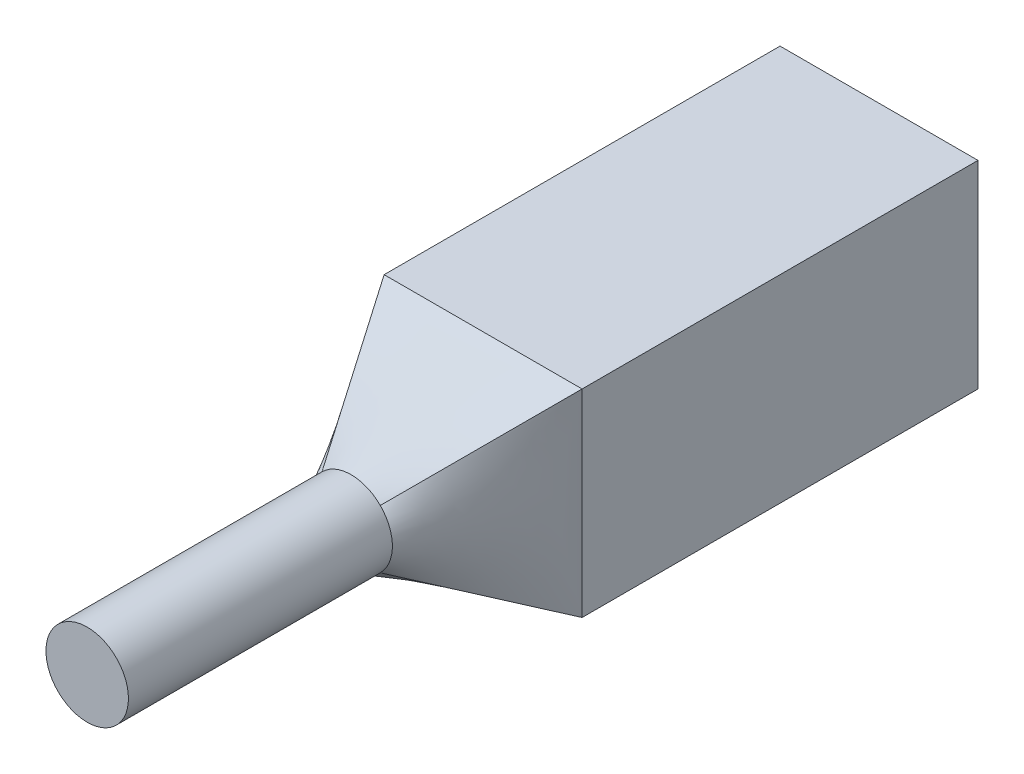
ISO-10303-21;
HEADER;
FILE_DESCRIPTION(('STEP AP214'),'2;1');
FILE_NAME('part.step','',(''),(''),'','','');
FILE_SCHEMA(('AUTOMOTIVE_DESIGN { 1 0 10303 214 1 1 1 1 }'));
ENDSEC;
DATA;
#1=APPLICATION_CONTEXT('core data for automotive mechanical design processes');
#2=APPLICATION_PROTOCOL_DEFINITION('international standard','automotive_design',2000,#1);
#3=PRODUCT_CONTEXT('',#1,'mechanical');
#4=PRODUCT('Part','Part','',(#3));
#5=PRODUCT_RELATED_PRODUCT_CATEGORY('part','',(#4));
#6=PRODUCT_DEFINITION_FORMATION('','',#4);
#7=PRODUCT_DEFINITION_CONTEXT('part definition',#1,'design');
#8=PRODUCT_DEFINITION('design','',#6,#7);
#9=PRODUCT_DEFINITION_SHAPE('','',#8);
#10=(LENGTH_UNIT() NAMED_UNIT(*) SI_UNIT(.MILLI.,.METRE.));
#11=(NAMED_UNIT(*) PLANE_ANGLE_UNIT() SI_UNIT($,.RADIAN.));
#12=(NAMED_UNIT(*) SI_UNIT($,.STERADIAN.) SOLID_ANGLE_UNIT());
#13=UNCERTAINTY_MEASURE_WITH_UNIT(LENGTH_MEASURE(1.E-05),#10,'distance_accuracy_value','');
#14=(GEOMETRIC_REPRESENTATION_CONTEXT(3) GLOBAL_UNCERTAINTY_ASSIGNED_CONTEXT((#13)) GLOBAL_UNIT_ASSIGNED_CONTEXT((#10,
#11,#12)) REPRESENTATION_CONTEXT('',''));
#15=CARTESIAN_POINT('',(0.,0.,0.));
#16=DIRECTION('',(0.,0.,1.));
#17=DIRECTION('',(1.,0.,0.));
#18=AXIS2_PLACEMENT_3D('',#15,#16,#17);
#19=CARTESIAN_POINT('',(0.,0.,38.1));
#20=DIRECTION('',(1.,0.,0.));
#21=DIRECTION('',(0.,0.,-1.));
#22=AXIS2_PLACEMENT_3D('',#19,#20,#21);
#23=PLANE('',#22);
#24=DIRECTION('',(0.,-1.,0.));
#25=VECTOR('',#24,1.);
#26=CARTESIAN_POINT('',(0.,0.,0.));
#27=LINE('',#26,#25);
#28=CARTESIAN_POINT('',(0.,19.05,0.));
#29=VERTEX_POINT('',#28);
#30=CARTESIAN_POINT('',(0.,0.,0.));
#31=VERTEX_POINT('',#30);
#32=EDGE_CURVE('E185',#29,#31,#27,.T.);
#33=ORIENTED_EDGE('',*,*,#32,.T.);
#34=DIRECTION('',(0.,0.,-1.));
#35=VECTOR('',#34,1.);
#36=CARTESIAN_POINT('',(0.,0.,38.1));
#37=LINE('',#36,#35);
#38=CARTESIAN_POINT('',(0.,0.,38.1));
#39=VERTEX_POINT('',#38);
#40=EDGE_CURVE('E12',#39,#31,#37,.T.);
#41=ORIENTED_EDGE('',*,*,#40,.F.);
#42=DIRECTION('',(0.,1.,0.));
#43=VECTOR('',#42,1.);
#44=CARTESIAN_POINT('',(0.,0.,38.1));
#45=LINE('',#44,#43);
#46=CARTESIAN_POINT('',(0.,19.05,38.1));
#47=VERTEX_POINT('',#46);
#48=EDGE_CURVE('E142',#47,#39,#45,.F.);
#49=ORIENTED_EDGE('',*,*,#48,.F.);
#50=DIRECTION('',(0.,0.,-1.));
#51=VECTOR('',#50,1.);
#52=CARTESIAN_POINT('',(0.,19.05,38.1));
#53=LINE('',#52,#51);
#54=EDGE_CURVE('E167',#47,#29,#53,.T.);
#55=ORIENTED_EDGE('',*,*,#54,.T.);
#56=EDGE_LOOP('',(#33,#41,#49,#55));
#57=FACE_BOUND('',#56,.T.);
#58=ADVANCED_FACE('F67',(#57),#23,.F.);
#59=CARTESIAN_POINT('',(0.,0.,38.1));
#60=DIRECTION('',(0.,1.,0.));
#61=DIRECTION('',(0.,0.,1.));
#62=AXIS2_PLACEMENT_3D('',#59,#60,#61);
#63=PLANE('',#62);
#64=DIRECTION('',(1.,0.,0.));
#65=VECTOR('',#64,1.);
#66=CARTESIAN_POINT('',(0.,0.,0.));
#67=LINE('',#66,#65);
#68=CARTESIAN_POINT('',(19.05,0.,0.));
#69=VERTEX_POINT('',#68);
#70=EDGE_CURVE('E183',#31,#69,#67,.T.);
#71=ORIENTED_EDGE('',*,*,#70,.T.);
#72=DIRECTION('',(0.,0.,-1.));
#73=VECTOR('',#72,1.);
#74=CARTESIAN_POINT('',(19.05,0.,38.1));
#75=LINE('',#74,#73);
#76=CARTESIAN_POINT('',(19.05,0.,38.1));
#77=VERTEX_POINT('',#76);
#78=EDGE_CURVE('E77',#77,#69,#75,.T.);
#79=ORIENTED_EDGE('',*,*,#78,.F.);
#80=DIRECTION('',(1.,0.,0.));
#81=VECTOR('',#80,1.);
#82=CARTESIAN_POINT('',(0.,0.,38.1));
#83=LINE('',#82,#81);
#84=EDGE_CURVE('E171',#39,#77,#83,.T.);
#85=ORIENTED_EDGE('',*,*,#84,.F.);
#86=ORIENTED_EDGE('',*,*,#40,.T.);
#87=EDGE_LOOP('',(#71,#79,#85,#86));
#88=FACE_BOUND('',#87,.T.);
#89=ADVANCED_FACE('F272',(#88),#63,.F.);
#90=CARTESIAN_POINT('',(19.05,0.,38.1));
#91=DIRECTION('',(-1.,0.,0.));
#92=DIRECTION('',(0.,0.,1.));
#93=AXIS2_PLACEMENT_3D('',#90,#91,#92);
#94=PLANE('',#93);
#95=DIRECTION('',(0.,1.,0.));
#96=VECTOR('',#95,1.);
#97=CARTESIAN_POINT('',(19.05,0.,0.));
#98=LINE('',#97,#96);
#99=CARTESIAN_POINT('',(19.05,19.05,0.));
#100=VERTEX_POINT('',#99);
#101=EDGE_CURVE('E181',#69,#100,#98,.T.);
#102=ORIENTED_EDGE('',*,*,#101,.T.);
#103=DIRECTION('',(0.,0.,-1.));
#104=VECTOR('',#103,1.);
#105=CARTESIAN_POINT('',(19.05,19.05,38.1));
#106=LINE('',#105,#104);
#107=CARTESIAN_POINT('',(19.05,19.05,38.1));
#108=VERTEX_POINT('',#107);
#109=EDGE_CURVE('E85',#108,#100,#106,.T.);
#110=ORIENTED_EDGE('',*,*,#109,.F.);
#111=DIRECTION('',(0.,1.,0.));
#112=VECTOR('',#111,1.);
#113=CARTESIAN_POINT('',(19.05,0.,38.1));
#114=LINE('',#113,#112);
#115=EDGE_CURVE('E168',#77,#108,#114,.T.);
#116=ORIENTED_EDGE('',*,*,#115,.F.);
#117=ORIENTED_EDGE('',*,*,#78,.T.);
#118=EDGE_LOOP('',(#102,#110,#116,#117));
#119=FACE_BOUND('',#118,.T.);
#120=ADVANCED_FACE('F277',(#119),#94,.F.);
#121=CARTESIAN_POINT('',(0.,19.05,38.1));
#122=DIRECTION('',(0.,-1.,0.));
#123=DIRECTION('',(0.,0.,-1.));
#124=AXIS2_PLACEMENT_3D('',#121,#122,#123);
#125=PLANE('',#124);
#126=DIRECTION('',(-1.,0.,0.));
#127=VECTOR('',#126,1.);
#128=CARTESIAN_POINT('',(0.,19.05,0.));
#129=LINE('',#128,#127);
#130=EDGE_CURVE('E173',#100,#29,#129,.T.);
#131=ORIENTED_EDGE('',*,*,#130,.T.);
#132=ORIENTED_EDGE('',*,*,#54,.F.);
#133=DIRECTION('',(1.,0.,0.));
#134=VECTOR('',#133,1.);
#135=CARTESIAN_POINT('',(0.,19.05,38.1));
#136=LINE('',#135,#134);
#137=EDGE_CURVE('E164',#108,#47,#136,.F.);
#138=ORIENTED_EDGE('',*,*,#137,.F.);
#139=ORIENTED_EDGE('',*,*,#109,.T.);
#140=EDGE_LOOP('',(#131,#132,#138,#139));
#141=FACE_BOUND('',#140,.T.);
#142=ADVANCED_FACE('F290',(#141),#125,.F.);
#143=CARTESIAN_POINT('',(0.,0.,0.));
#144=DIRECTION('',(0.,0.,-1.));
#145=DIRECTION('',(-1.,0.,0.));
#146=AXIS2_PLACEMENT_3D('',#143,#144,#145);
#147=PLANE('',#146);
#148=ORIENTED_EDGE('',*,*,#32,.F.);
#149=ORIENTED_EDGE('',*,*,#130,.F.);
#150=ORIENTED_EDGE('',*,*,#101,.F.);
#151=ORIENTED_EDGE('',*,*,#70,.F.);
#152=EDGE_LOOP('',(#148,#149,#150,#151));
#153=FACE_BOUND('',#152,.T.);
#154=ADVANCED_FACE('F219',(#153),#147,.T.);
#155=CARTESIAN_POINT('',(12.3313300378341,12.3313300378341,50.8));
#156=CARTESIAN_POINT('',(19.05,19.05,38.1));
#157=CARTESIAN_POINT('',(12.6620592045008,12.0006008711674,50.8));
#158=CARTESIAN_POINT('',(19.05,17.4625,38.1));
#159=CARTESIAN_POINT('',(12.9585981787103,11.5835090371438,50.8));
#160=CARTESIAN_POINT('',(19.05,15.875,38.1));
#161=CARTESIAN_POINT('',(13.3759779779088,10.6190861586301,50.8));
#162=CARTESIAN_POINT('',(19.05,12.7,38.1));
#163=CARTESIAN_POINT('',(13.49375,10.0729700252227,50.8));
#164=CARTESIAN_POINT('',(19.05,11.1125,38.1));
#165=CARTESIAN_POINT('',(13.49375,8.97702997477725,50.8));
#166=CARTESIAN_POINT('',(19.05,7.93749999999999,38.1));
#167=CARTESIAN_POINT('',(13.3759779779088,8.43091384136988,50.8));
#168=CARTESIAN_POINT('',(19.05,6.34999999999999,38.1));
#169=CARTESIAN_POINT('',(12.9585981787103,7.46649096285624,50.8));
#170=CARTESIAN_POINT('',(19.05,3.175,38.1));
#171=CARTESIAN_POINT('',(12.6620592045008,7.04939912883255,50.8));
#172=CARTESIAN_POINT('',(19.05,1.5875,38.1));
#173=CARTESIAN_POINT('',(12.3313300378341,6.71866996216589,50.8));
#174=CARTESIAN_POINT('',(19.05,0.,38.1));
#175=B_SPLINE_SURFACE_WITH_KNOTS('',3,1,((#155,#156),(#157,#158),(#159,#160),(#161,#162),(#163,
#164),(#165,#166),(#167,#168),(#169,#170),(#171,#172),(#173,#174)),.UNSPECIFIED.,.F.,.F.,.F.,(4,
2,2,2,4),(2,2),(0.,0.25,0.5,0.75,1.),(0.,1.),.UNSPECIFIED.);
#176=CARTESIAN_POINT('',(9.525,9.525,50.8));
#177=DIRECTION('',(0.,0.,1.));
#178=DIRECTION('',(1.,0.,0.));
#179=AXIS2_PLACEMENT_3D('',#176,#177,#178);
#180=CIRCLE('',#179,3.96875);
#181=CARTESIAN_POINT('',(12.3313300378341,6.71866996216589,50.8));
#182=VERTEX_POINT('',#181);
#183=CARTESIAN_POINT('',(12.3313300378341,12.3313300378341,50.8));
#184=VERTEX_POINT('',#183);
#185=EDGE_CURVE('E70',#182,#184,#180,.T.);
#186=DIRECTION('',(0.423597096817351,-0.423597096817351,-0.800706562440838));
#187=VECTOR('',#186,1.);
#188=CARTESIAN_POINT('',(15.6906650189171,3.35933498108294,44.45));
#189=LINE('',#188,#187);
#190=EDGE_CURVE('E126',#182,#77,#189,.T.);
#191=DIRECTION('',(-0.423597096817351,-0.423597096817351,0.800706562440838));
#192=VECTOR('',#191,1.);
#193=CARTESIAN_POINT('',(15.6906650189171,15.6906650189171,44.45));
#194=LINE('',#193,#192);
#195=EDGE_CURVE('E131',#108,#184,#194,.T.);
#196=ORIENTED_EDGE('',*,*,#185,.F.);
#197=ORIENTED_EDGE('',*,*,#190,.T.);
#198=ORIENTED_EDGE('',*,*,#115,.T.);
#199=ORIENTED_EDGE('',*,*,#195,.T.);
#200=EDGE_LOOP('',(#196,#197,#198,#199));
#201=FACE_BOUND('',#200,.T.);
#202=ADVANCED_FACE('F246',(#201),#175,.T.);
#203=CARTESIAN_POINT('',(12.3313300378341,6.71866996216589,50.8));
#204=CARTESIAN_POINT('',(19.05,0.,38.1));
#205=CARTESIAN_POINT('',(12.0006008711674,6.38794079549922,50.8));
#206=CARTESIAN_POINT('',(17.4625,0.,38.1));
#207=CARTESIAN_POINT('',(11.5835090371438,6.09140182128975,50.8));
#208=CARTESIAN_POINT('',(15.875,0.,38.1));
#209=CARTESIAN_POINT('',(10.6190861586301,5.67402202209115,50.8));
#210=CARTESIAN_POINT('',(12.7,0.,38.1));
#211=CARTESIAN_POINT('',(10.0729700252227,5.55625,50.8));
#212=CARTESIAN_POINT('',(11.1125,0.,38.1));
#213=CARTESIAN_POINT('',(8.97702997477727,5.55625,50.8));
#214=CARTESIAN_POINT('',(7.93749999999998,0.,38.1));
#215=CARTESIAN_POINT('',(8.43091384136989,5.67402202209115,50.8));
#216=CARTESIAN_POINT('',(6.34999999999998,0.,38.1));
#217=CARTESIAN_POINT('',(7.46649096285624,6.09140182128975,50.8));
#218=CARTESIAN_POINT('',(3.17499999999999,0.,38.1));
#219=CARTESIAN_POINT('',(7.04939912883256,6.38794079549922,50.8));
#220=CARTESIAN_POINT('',(1.58749999999999,0.,38.1));
#221=CARTESIAN_POINT('',(6.71866996216589,6.71866996216589,50.8));
#222=CARTESIAN_POINT('',(0.,0.,38.1));
#223=B_SPLINE_SURFACE_WITH_KNOTS('',3,1,((#203,#204),(#205,#206),(#207,#208),(#209,#210),(#211,
#212),(#213,#214),(#215,#216),(#217,#218),(#219,#220),(#221,#222)),.UNSPECIFIED.,.F.,.F.,.F.,(4,
2,2,2,4),(2,2),(0.,0.25,0.5,0.75,1.),(0.,1.),.UNSPECIFIED.);
#224=CARTESIAN_POINT('',(6.71866996216589,6.71866996216589,50.8));
#225=VERTEX_POINT('',#224);
#226=EDGE_CURVE('E119',#225,#182,#180,.T.);
#227=DIRECTION('',(-0.423597096817352,-0.423597096817351,-0.800706562440837));
#228=VECTOR('',#227,1.);
#229=CARTESIAN_POINT('',(3.35933498108295,3.35933498108294,44.45));
#230=LINE('',#229,#228);
#231=EDGE_CURVE('E124',#225,#39,#230,.T.);
#232=ORIENTED_EDGE('',*,*,#226,.F.);
#233=ORIENTED_EDGE('',*,*,#231,.T.);
#234=ORIENTED_EDGE('',*,*,#84,.T.);
#235=ORIENTED_EDGE('',*,*,#190,.F.);
#236=EDGE_LOOP('',(#232,#233,#234,#235));
#237=FACE_BOUND('',#236,.T.);
#238=ADVANCED_FACE('F122',(#237),#223,.T.);
#239=CARTESIAN_POINT('',(6.71866996216589,12.3313300378341,50.8));
#240=CARTESIAN_POINT('',(0.,19.05,38.1));
#241=CARTESIAN_POINT('',(7.04939912883256,12.6620592045008,50.8));
#242=CARTESIAN_POINT('',(1.5875,19.05,38.1));
#243=CARTESIAN_POINT('',(7.46649096285624,12.9585981787103,50.8));
#244=CARTESIAN_POINT('',(3.17499999999999,19.05,38.1));
#245=CARTESIAN_POINT('',(8.43091384136989,13.3759779779088,50.8));
#246=CARTESIAN_POINT('',(6.34999999999999,19.05,38.1));
#247=CARTESIAN_POINT('',(8.97702997477727,13.49375,50.8));
#248=CARTESIAN_POINT('',(7.93749999999999,19.05,38.1));
#249=CARTESIAN_POINT('',(10.0729700252227,13.49375,50.8));
#250=CARTESIAN_POINT('',(11.1125,19.05,38.1));
#251=CARTESIAN_POINT('',(10.6190861586301,13.3759779779088,50.8));
#252=CARTESIAN_POINT('',(12.7,19.05,38.1));
#253=CARTESIAN_POINT('',(11.5835090371438,12.9585981787103,50.8));
#254=CARTESIAN_POINT('',(15.875,19.05,38.1));
#255=CARTESIAN_POINT('',(12.0006008711675,12.6620592045008,50.8));
#256=CARTESIAN_POINT('',(17.4625,19.05,38.1));
#257=CARTESIAN_POINT('',(12.3313300378341,12.3313300378341,50.8));
#258=CARTESIAN_POINT('',(19.05,19.05,38.1));
#259=B_SPLINE_SURFACE_WITH_KNOTS('',3,1,((#239,#240),(#241,#242),(#243,#244),(#245,#246),(#247,
#248),(#249,#250),(#251,#252),(#253,#254),(#255,#256),(#257,#258)),.UNSPECIFIED.,.F.,.F.,.F.,(4,
2,2,2,4),(2,2),(0.,0.25,0.5,0.75,1.),(0.,1.),.UNSPECIFIED.);
#260=CARTESIAN_POINT('',(6.71866996216589,12.3313300378341,50.8));
#261=VERTEX_POINT('',#260);
#262=EDGE_CURVE('E148',#184,#261,#180,.T.);
#263=DIRECTION('',(-0.423597096817352,0.423597096817351,-0.800706562440837));
#264=VECTOR('',#263,1.);
#265=CARTESIAN_POINT('',(3.35933498108295,15.6906650189171,44.45));
#266=LINE('',#265,#264);
#267=EDGE_CURVE('E143',#261,#47,#266,.T.);
#268=ORIENTED_EDGE('',*,*,#262,.F.);
#269=ORIENTED_EDGE('',*,*,#195,.F.);
#270=ORIENTED_EDGE('',*,*,#137,.T.);
#271=ORIENTED_EDGE('',*,*,#267,.F.);
#272=EDGE_LOOP('',(#268,#269,#270,#271));
#273=FACE_BOUND('',#272,.T.);
#274=ADVANCED_FACE('F192',(#273),#259,.T.);
#275=CARTESIAN_POINT('',(6.71866996216589,6.71866996216589,50.8));
#276=CARTESIAN_POINT('',(0.,0.,38.1));
#277=CARTESIAN_POINT('',(6.38794079549923,7.04939912883255,50.8));
#278=CARTESIAN_POINT('',(0.,1.5875,38.1));
#279=CARTESIAN_POINT('',(6.09140182128975,7.46649096285624,50.8));
#280=CARTESIAN_POINT('',(0.,3.175,38.1));
#281=CARTESIAN_POINT('',(5.67402202209116,8.43091384136989,50.8));
#282=CARTESIAN_POINT('',(0.,6.35,38.1));
#283=CARTESIAN_POINT('',(5.55625000000001,8.97702997477726,50.8));
#284=CARTESIAN_POINT('',(0.,7.9375,38.1));
#285=CARTESIAN_POINT('',(5.55625,10.0729700252227,50.8));
#286=CARTESIAN_POINT('',(0.,11.1125,38.1));
#287=CARTESIAN_POINT('',(5.67402202209116,10.6190861586301,50.8));
#288=CARTESIAN_POINT('',(0.,12.7,38.1));
#289=CARTESIAN_POINT('',(6.09140182128975,11.5835090371438,50.8));
#290=CARTESIAN_POINT('',(0.,15.875,38.1));
#291=CARTESIAN_POINT('',(6.38794079549923,12.0006008711674,50.8));
#292=CARTESIAN_POINT('',(0.,17.4625,38.1));
#293=CARTESIAN_POINT('',(6.71866996216589,12.3313300378341,50.8));
#294=CARTESIAN_POINT('',(0.,19.05,38.1));
#295=B_SPLINE_SURFACE_WITH_KNOTS('',3,1,((#275,#276),(#277,#278),(#279,#280),(#281,#282),(#283,
#284),(#285,#286),(#287,#288),(#289,#290),(#291,#292),(#293,#294)),.UNSPECIFIED.,.F.,.F.,.F.,(4,
2,2,2,4),(2,2),(0.,0.25,0.5,0.75,1.),(0.,1.),.UNSPECIFIED.);
#296=EDGE_CURVE('E138',#261,#225,#180,.T.);
#297=ORIENTED_EDGE('',*,*,#296,.F.);
#298=ORIENTED_EDGE('',*,*,#267,.T.);
#299=ORIENTED_EDGE('',*,*,#48,.T.);
#300=ORIENTED_EDGE('',*,*,#231,.F.);
#301=EDGE_LOOP('',(#297,#298,#299,#300));
#302=FACE_BOUND('',#301,.T.);
#303=ADVANCED_FACE('F136',(#302),#295,.T.);
#304=CARTESIAN_POINT('',(9.525,9.525,76.2));
#305=DIRECTION('',(0.,0.,-1.));
#306=DIRECTION('',(-1.,0.,0.));
#307=AXIS2_PLACEMENT_3D('',#304,#305,#306);
#308=CYLINDRICAL_SURFACE('',#307,3.96875);
#309=CARTESIAN_POINT('',(9.525,9.525,76.2));
#310=DIRECTION('',(0.,0.,1.));
#311=DIRECTION('',(1.,0.,0.));
#312=AXIS2_PLACEMENT_3D('',#309,#310,#311);
#313=CIRCLE('',#312,3.96875);
#314=CARTESIAN_POINT('',(13.49375,9.525,76.2));
#315=VERTEX_POINT('',#314);
#316=EDGE_CURVE('E150',#315,#315,#313,.T.);
#317=ORIENTED_EDGE('',*,*,#316,.F.);
#318=EDGE_LOOP('',(#317));
#319=FACE_BOUND('',#318,.T.);
#320=ORIENTED_EDGE('',*,*,#262,.T.);
#321=ORIENTED_EDGE('',*,*,#296,.T.);
#322=ORIENTED_EDGE('',*,*,#226,.T.);
#323=ORIENTED_EDGE('',*,*,#185,.T.);
#324=EDGE_LOOP('',(#320,#321,#322,#323));
#325=FACE_BOUND('',#324,.T.);
#326=ADVANCED_FACE('F147',(#319,#325),#308,.T.);
#327=CARTESIAN_POINT('',(9.525,9.525,76.2));
#328=DIRECTION('',(0.,0.,1.));
#329=DIRECTION('',(1.,0.,0.));
#330=AXIS2_PLACEMENT_3D('',#327,#328,#329);
#331=PLANE('',#330);
#332=ORIENTED_EDGE('',*,*,#316,.T.);
#333=EDGE_LOOP('',(#332));
#334=FACE_BOUND('',#333,.T.);
#335=ADVANCED_FACE('F264',(#334),#331,.T.);
#336=CLOSED_SHELL('',(#58,#89,#120,#142,#154,#202,#238,#274,#303,#326,#335));
#337=MANIFOLD_SOLID_BREP('B2',#336);
#338=ADVANCED_BREP_SHAPE_REPRESENTATION('',(#18,#337),#14);
#339=SHAPE_DEFINITION_REPRESENTATION(#9,#338);
ENDSEC;
END-ISO-10303-21;
